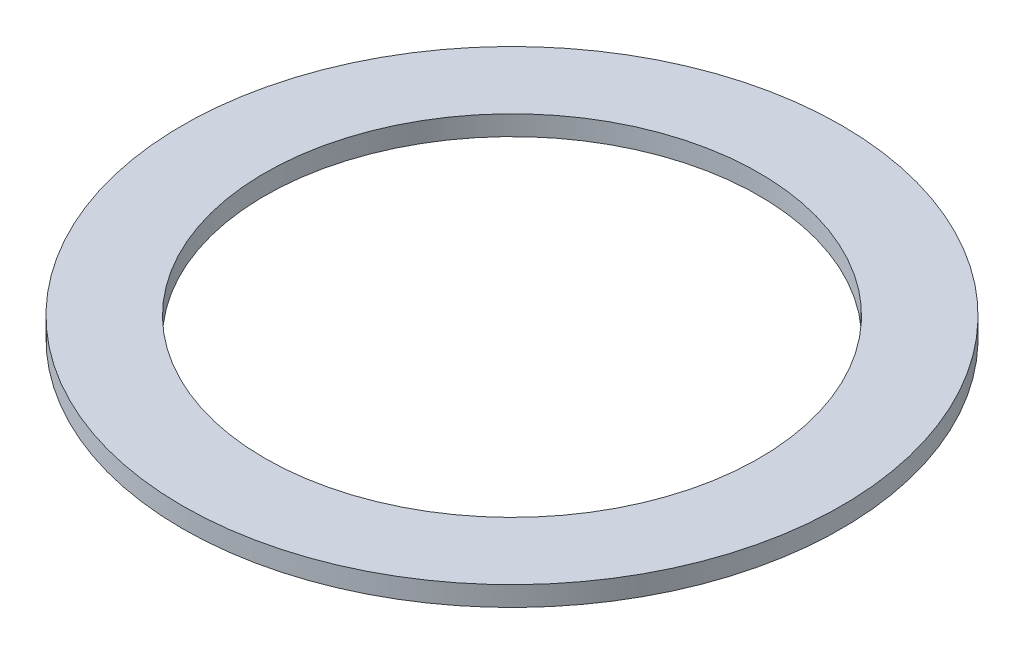
ISO-10303-21;
HEADER;
FILE_DESCRIPTION(('STEP AP214'),'2;1');
FILE_NAME('part.step','',(''),(''),'','','');
FILE_SCHEMA(('AUTOMOTIVE_DESIGN { 1 0 10303 214 1 1 1 1 }'));
ENDSEC;
DATA;
#1=APPLICATION_CONTEXT('core data for automotive mechanical design processes');
#2=APPLICATION_PROTOCOL_DEFINITION('international standard','automotive_design',2000,#1);
#3=PRODUCT_CONTEXT('',#1,'mechanical');
#4=PRODUCT('Part','Part','',(#3));
#5=PRODUCT_RELATED_PRODUCT_CATEGORY('part','',(#4));
#6=PRODUCT_DEFINITION_FORMATION('','',#4);
#7=PRODUCT_DEFINITION_CONTEXT('part definition',#1,'design');
#8=PRODUCT_DEFINITION('design','',#6,#7);
#9=PRODUCT_DEFINITION_SHAPE('','',#8);
#10=(LENGTH_UNIT() NAMED_UNIT(*) SI_UNIT(.MILLI.,.METRE.));
#11=(NAMED_UNIT(*) PLANE_ANGLE_UNIT() SI_UNIT($,.RADIAN.));
#12=(NAMED_UNIT(*) SI_UNIT($,.STERADIAN.) SOLID_ANGLE_UNIT());
#13=UNCERTAINTY_MEASURE_WITH_UNIT(LENGTH_MEASURE(1.E-05),#10,'distance_accuracy_value','');
#14=(GEOMETRIC_REPRESENTATION_CONTEXT(3) GLOBAL_UNCERTAINTY_ASSIGNED_CONTEXT((#13)) GLOBAL_UNIT_ASSIGNED_CONTEXT((#10,
#11,#12)) REPRESENTATION_CONTEXT('',''));
#15=CARTESIAN_POINT('',(0.,0.,0.));
#16=DIRECTION('',(0.,0.,1.));
#17=DIRECTION('',(1.,0.,0.));
#18=AXIS2_PLACEMENT_3D('',#15,#16,#17);
#19=CARTESIAN_POINT('',(0.,14.2862136821391,0.));
#20=DIRECTION('',(0.,1.,0.));
#21=DIRECTION('',(0.,0.,1.));
#22=AXIS2_PLACEMENT_3D('',#19,#20,#21);
#23=CYLINDRICAL_SURFACE('',#22,4.7625);
#24=CARTESIAN_POINT('',(0.,-0.1905,0.));
#25=DIRECTION('',(0.,1.,0.));
#26=DIRECTION('',(0.,0.,1.));
#27=AXIS2_PLACEMENT_3D('',#24,#25,#26);
#28=CIRCLE('',#27,4.7625);
#29=CARTESIAN_POINT('',(0.,-0.1905,4.7625));
#30=VERTEX_POINT('',#29);
#31=EDGE_CURVE('E10',#30,#30,#28,.T.);
#32=ORIENTED_EDGE('',*,*,#31,.F.);
#33=EDGE_LOOP('',(#32));
#34=FACE_BOUND('',#33,.T.);
#35=CARTESIAN_POINT('',(0.,0.1905,0.));
#36=DIRECTION('',(0.,1.,0.));
#37=DIRECTION('',(0.,0.,1.));
#38=AXIS2_PLACEMENT_3D('',#35,#36,#37);
#39=CIRCLE('',#38,4.7625);
#40=CARTESIAN_POINT('',(0.,0.1905,4.7625));
#41=VERTEX_POINT('',#40);
#42=EDGE_CURVE('E55',#41,#41,#39,.T.);
#43=ORIENTED_EDGE('',*,*,#42,.T.);
#44=EDGE_LOOP('',(#43));
#45=FACE_BOUND('',#44,.T.);
#46=ADVANCED_FACE('F33',(#34,#45),#23,.F.);
#47=CARTESIAN_POINT('',(0.,-0.1905,-4.7625));
#48=DIRECTION('',(0.,1.,0.));
#49=DIRECTION('',(0.,0.,1.));
#50=AXIS2_PLACEMENT_3D('',#47,#48,#49);
#51=PLANE('',#50);
#52=CARTESIAN_POINT('',(0.,-0.1905,0.));
#53=DIRECTION('',(0.,1.,0.));
#54=DIRECTION('',(0.,0.,1.));
#55=AXIS2_PLACEMENT_3D('',#52,#53,#54);
#56=CIRCLE('',#55,6.35);
#57=CARTESIAN_POINT('',(0.,-0.1905,6.35));
#58=VERTEX_POINT('',#57);
#59=EDGE_CURVE('E40',#58,#58,#56,.T.);
#60=ORIENTED_EDGE('',*,*,#59,.F.);
#61=EDGE_LOOP('',(#60));
#62=FACE_BOUND('',#61,.T.);
#63=ORIENTED_EDGE('',*,*,#31,.T.);
#64=EDGE_LOOP('',(#63));
#65=FACE_BOUND('',#64,.T.);
#66=ADVANCED_FACE('F73',(#62,#65),#51,.F.);
#67=CARTESIAN_POINT('',(0.,14.2862136821391,0.));
#68=DIRECTION('',(0.,1.,0.));
#69=DIRECTION('',(0.,0.,1.));
#70=AXIS2_PLACEMENT_3D('',#67,#68,#69);
#71=CYLINDRICAL_SURFACE('',#70,6.35);
#72=CARTESIAN_POINT('',(0.,0.1905,0.));
#73=DIRECTION('',(0.,1.,0.));
#74=DIRECTION('',(0.,0.,1.));
#75=AXIS2_PLACEMENT_3D('',#72,#73,#74);
#76=CIRCLE('',#75,6.35);
#77=CARTESIAN_POINT('',(0.,0.1905,6.35));
#78=VERTEX_POINT('',#77);
#79=EDGE_CURVE('E48',#78,#78,#76,.T.);
#80=ORIENTED_EDGE('',*,*,#79,.F.);
#81=EDGE_LOOP('',(#80));
#82=FACE_BOUND('',#81,.T.);
#83=ORIENTED_EDGE('',*,*,#59,.T.);
#84=EDGE_LOOP('',(#83));
#85=FACE_BOUND('',#84,.T.);
#86=ADVANCED_FACE('F68',(#82,#85),#71,.T.);
#87=CARTESIAN_POINT('',(0.,0.1905,-4.7625));
#88=DIRECTION('',(0.,-1.,0.));
#89=DIRECTION('',(0.,0.,-1.));
#90=AXIS2_PLACEMENT_3D('',#87,#88,#89);
#91=PLANE('',#90);
#92=ORIENTED_EDGE('',*,*,#42,.F.);
#93=EDGE_LOOP('',(#92));
#94=FACE_BOUND('',#93,.T.);
#95=ORIENTED_EDGE('',*,*,#79,.T.);
#96=EDGE_LOOP('',(#95));
#97=FACE_BOUND('',#96,.T.);
#98=ADVANCED_FACE('F65',(#94,#97),#91,.F.);
#99=CLOSED_SHELL('',(#46,#66,#86,#98));
#100=MANIFOLD_SOLID_BREP('B2',#99);
#101=ADVANCED_BREP_SHAPE_REPRESENTATION('',(#18,#100),#14);
#102=SHAPE_DEFINITION_REPRESENTATION(#9,#101);
ENDSEC;
END-ISO-10303-21;
